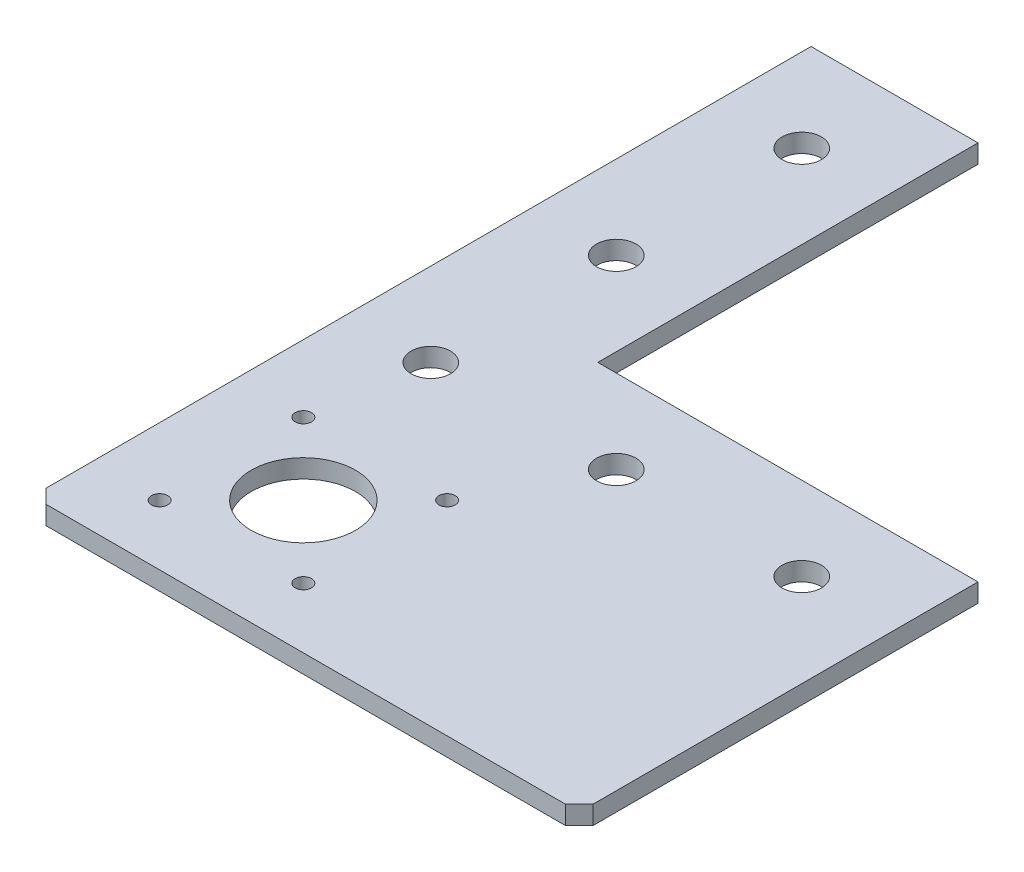
ISO-10303-21;
HEADER;
FILE_DESCRIPTION(('STEP AP214'),'2;1');
FILE_NAME('part.step','',(''),(''),'','','');
FILE_SCHEMA(('AUTOMOTIVE_DESIGN { 1 0 10303 214 1 1 1 1 }'));
ENDSEC;
DATA;
#1=APPLICATION_CONTEXT('core data for automotive mechanical design processes');
#2=APPLICATION_PROTOCOL_DEFINITION('international standard','automotive_design',2000,#1);
#3=PRODUCT_CONTEXT('',#1,'mechanical');
#4=PRODUCT('Part','Part','',(#3));
#5=PRODUCT_RELATED_PRODUCT_CATEGORY('part','',(#4));
#6=PRODUCT_DEFINITION_FORMATION('','',#4);
#7=PRODUCT_DEFINITION_CONTEXT('part definition',#1,'design');
#8=PRODUCT_DEFINITION('design','',#6,#7);
#9=PRODUCT_DEFINITION_SHAPE('','',#8);
#10=(LENGTH_UNIT() NAMED_UNIT(*) SI_UNIT(.MILLI.,.METRE.));
#11=(NAMED_UNIT(*) PLANE_ANGLE_UNIT() SI_UNIT($,.RADIAN.));
#12=(NAMED_UNIT(*) SI_UNIT($,.STERADIAN.) SOLID_ANGLE_UNIT());
#13=UNCERTAINTY_MEASURE_WITH_UNIT(LENGTH_MEASURE(1.E-05),#10,'distance_accuracy_value','');
#14=(GEOMETRIC_REPRESENTATION_CONTEXT(3) GLOBAL_UNCERTAINTY_ASSIGNED_CONTEXT((#13)) GLOBAL_UNIT_ASSIGNED_CONTEXT((#10,
#11,#12)) REPRESENTATION_CONTEXT('',''));
#15=CARTESIAN_POINT('',(0.,0.,0.));
#16=DIRECTION('',(0.,0.,1.));
#17=DIRECTION('',(1.,0.,0.));
#18=AXIS2_PLACEMENT_3D('',#15,#16,#17);
#19=CARTESIAN_POINT('',(0.,4.,-5.99999999999999));
#20=DIRECTION('',(0.,0.,1.));
#21=DIRECTION('',(1.,0.,0.));
#22=AXIS2_PLACEMENT_3D('',#19,#20,#21);
#23=PLANE('',#22);
#24=DIRECTION('',(-1.,0.,0.));
#25=VECTOR('',#24,1.);
#26=CARTESIAN_POINT('',(0.,0.,-5.99999999999999));
#27=LINE('',#26,#25);
#28=CARTESIAN_POINT('',(88.,0.,-6.));
#29=VERTEX_POINT('',#28);
#30=CARTESIAN_POINT('',(6.00000000000001,0.,-5.99999999999999));
#31=VERTEX_POINT('',#30);
#32=EDGE_CURVE('E130',#29,#31,#27,.T.);
#33=ORIENTED_EDGE('',*,*,#32,.T.);
#34=DIRECTION('',(0.,-1.,0.));
#35=VECTOR('',#34,1.);
#36=CARTESIAN_POINT('',(6.00000000000001,4.,-5.99999999999999));
#37=LINE('',#36,#35);
#38=CARTESIAN_POINT('',(6.00000000000001,4.,-5.99999999999999));
#39=VERTEX_POINT('',#38);
#40=EDGE_CURVE('E110',#39,#31,#37,.T.);
#41=ORIENTED_EDGE('',*,*,#40,.F.);
#42=DIRECTION('',(-1.,0.,0.));
#43=VECTOR('',#42,1.);
#44=CARTESIAN_POINT('',(0.,4.,-5.99999999999999));
#45=LINE('',#44,#43);
#46=CARTESIAN_POINT('',(88.,4.,-6.));
#47=VERTEX_POINT('',#46);
#48=EDGE_CURVE('E117',#47,#39,#45,.T.);
#49=ORIENTED_EDGE('',*,*,#48,.F.);
#50=DIRECTION('',(0.,-1.,0.));
#51=VECTOR('',#50,1.);
#52=CARTESIAN_POINT('',(88.,4.,-6.));
#53=LINE('',#52,#51);
#54=EDGE_CURVE('E155',#47,#29,#53,.T.);
#55=ORIENTED_EDGE('',*,*,#54,.T.);
#56=EDGE_LOOP('',(#33,#41,#49,#55));
#57=FACE_BOUND('',#56,.T.);
#58=ADVANCED_FACE('F39',(#57),#23,.F.);
#59=CARTESIAN_POINT('',(6.00000000000001,4.,0.));
#60=DIRECTION('',(-1.,0.,0.));
#61=DIRECTION('',(0.,0.,1.));
#62=AXIS2_PLACEMENT_3D('',#59,#60,#61);
#63=PLANE('',#62);
#64=DIRECTION('',(0.,0.,-1.));
#65=VECTOR('',#64,1.);
#66=CARTESIAN_POINT('',(6.00000000000001,0.,0.));
#67=LINE('',#66,#65);
#68=CARTESIAN_POINT('',(6.00000000000001,0.,-88.));
#69=VERTEX_POINT('',#68);
#70=EDGE_CURVE('E210',#31,#69,#67,.T.);
#71=ORIENTED_EDGE('',*,*,#70,.T.);
#72=DIRECTION('',(0.,-1.,0.));
#73=VECTOR('',#72,1.);
#74=CARTESIAN_POINT('',(6.00000000000001,4.,-88.));
#75=LINE('',#74,#73);
#76=CARTESIAN_POINT('',(6.00000000000001,4.,-88.));
#77=VERTEX_POINT('',#76);
#78=EDGE_CURVE('E112',#77,#69,#75,.T.);
#79=ORIENTED_EDGE('',*,*,#78,.F.);
#80=DIRECTION('',(0.,0.,-1.));
#81=VECTOR('',#80,1.);
#82=CARTESIAN_POINT('',(6.00000000000001,4.,0.));
#83=LINE('',#82,#81);
#84=EDGE_CURVE('E105',#39,#77,#83,.T.);
#85=ORIENTED_EDGE('',*,*,#84,.F.);
#86=ORIENTED_EDGE('',*,*,#40,.T.);
#87=EDGE_LOOP('',(#71,#79,#85,#86));
#88=FACE_BOUND('',#87,.T.);
#89=ADVANCED_FACE('F108',(#88),#63,.F.);
#90=CARTESIAN_POINT('',(0.,4.,-88.));
#91=DIRECTION('',(0.,0.,-1.));
#92=DIRECTION('',(-1.,0.,0.));
#93=AXIS2_PLACEMENT_3D('',#90,#91,#92);
#94=PLANE('',#93);
#95=DIRECTION('',(1.,0.,0.));
#96=VECTOR('',#95,1.);
#97=CARTESIAN_POINT('',(0.,0.,-88.));
#98=LINE('',#97,#96);
#99=CARTESIAN_POINT('',(-30.,0.,-88.));
#100=VERTEX_POINT('',#99);
#101=EDGE_CURVE('E212',#100,#69,#98,.T.);
#102=ORIENTED_EDGE('',*,*,#101,.F.);
#103=DIRECTION('',(0.,-1.,0.));
#104=VECTOR('',#103,1.);
#105=CARTESIAN_POINT('',(-30.,4.,-88.));
#106=LINE('',#105,#104);
#107=CARTESIAN_POINT('',(-30.,4.,-88.));
#108=VERTEX_POINT('',#107);
#109=EDGE_CURVE('E136',#108,#100,#106,.T.);
#110=ORIENTED_EDGE('',*,*,#109,.F.);
#111=DIRECTION('',(1.,0.,0.));
#112=VECTOR('',#111,1.);
#113=CARTESIAN_POINT('',(0.,4.,-88.));
#114=LINE('',#113,#112);
#115=EDGE_CURVE('E116',#108,#77,#114,.T.);
#116=ORIENTED_EDGE('',*,*,#115,.T.);
#117=ORIENTED_EDGE('',*,*,#78,.T.);
#118=EDGE_LOOP('',(#102,#110,#116,#117));
#119=FACE_BOUND('',#118,.T.);
#120=ADVANCED_FACE('F223',(#119),#94,.T.);
#121=CARTESIAN_POINT('',(-30.,4.,0.));
#122=DIRECTION('',(-1.,0.,0.));
#123=DIRECTION('',(0.,0.,1.));
#124=AXIS2_PLACEMENT_3D('',#121,#122,#123);
#125=PLANE('',#124);
#126=DIRECTION('',(0.,0.,-1.));
#127=VECTOR('',#126,1.);
#128=CARTESIAN_POINT('',(-30.,0.,0.));
#129=LINE('',#128,#127);
#130=CARTESIAN_POINT('',(-30.,0.,77.));
#131=VERTEX_POINT('',#130);
#132=EDGE_CURVE('E215',#131,#100,#129,.T.);
#133=ORIENTED_EDGE('',*,*,#132,.F.);
#134=DIRECTION('',(0.,1.,0.));
#135=VECTOR('',#134,1.);
#136=CARTESIAN_POINT('',(-30.,4.,77.));
#137=LINE('',#136,#135);
#138=CARTESIAN_POINT('',(-30.,4.,77.));
#139=VERTEX_POINT('',#138);
#140=EDGE_CURVE('E11',#131,#139,#137,.T.);
#141=ORIENTED_EDGE('',*,*,#140,.T.);
#142=DIRECTION('',(0.,0.,-1.));
#143=VECTOR('',#142,1.);
#144=CARTESIAN_POINT('',(-30.,4.,0.));
#145=LINE('',#144,#143);
#146=EDGE_CURVE('E156',#139,#108,#145,.T.);
#147=ORIENTED_EDGE('',*,*,#146,.T.);
#148=ORIENTED_EDGE('',*,*,#109,.T.);
#149=EDGE_LOOP('',(#133,#141,#147,#148));
#150=FACE_BOUND('',#149,.T.);
#151=ADVANCED_FACE('F221',(#150),#125,.T.);
#152=CARTESIAN_POINT('',(-12.,4.,12.0111306113721));
#153=DIRECTION('',(0.,-1.,0.));
#154=DIRECTION('',(0.,0.,-1.));
#155=AXIS2_PLACEMENT_3D('',#152,#153,#154);
#156=CYLINDRICAL_SURFACE('',#155,4.25);
#157=CARTESIAN_POINT('',(-12.,4.,12.0111306113721));
#158=DIRECTION('',(0.,1.,0.));
#159=DIRECTION('',(0.,0.,1.));
#160=AXIS2_PLACEMENT_3D('',#157,#158,#159);
#161=CIRCLE('',#160,4.25);
#162=CARTESIAN_POINT('',(-12.,4.,16.2611306113721));
#163=VERTEX_POINT('',#162);
#164=EDGE_CURVE('E127',#163,#163,#161,.T.);
#165=ORIENTED_EDGE('',*,*,#164,.T.);
#166=EDGE_LOOP('',(#165));
#167=FACE_BOUND('',#166,.T.);
#168=CARTESIAN_POINT('',(-12.,0.,12.0111306113721));
#169=DIRECTION('',(0.,1.,0.));
#170=DIRECTION('',(0.,0.,1.));
#171=AXIS2_PLACEMENT_3D('',#168,#169,#170);
#172=CIRCLE('',#171,4.25);
#173=CARTESIAN_POINT('',(-12.,0.,16.2611306113721));
#174=VERTEX_POINT('',#173);
#175=EDGE_CURVE('E206',#174,#174,#172,.T.);
#176=ORIENTED_EDGE('',*,*,#175,.F.);
#177=EDGE_LOOP('',(#176));
#178=FACE_BOUND('',#177,.T.);
#179=ADVANCED_FACE('F270',(#167,#178),#156,.F.);
#180=CARTESIAN_POINT('',(28.,4.,12.0111306113721));
#181=DIRECTION('',(0.,-1.,0.));
#182=DIRECTION('',(0.,0.,-1.));
#183=AXIS2_PLACEMENT_3D('',#180,#181,#182);
#184=CYLINDRICAL_SURFACE('',#183,4.25);
#185=CARTESIAN_POINT('',(28.,4.,12.0111306113721));
#186=DIRECTION('',(0.,1.,0.));
#187=DIRECTION('',(0.,0.,1.));
#188=AXIS2_PLACEMENT_3D('',#185,#186,#187);
#189=CIRCLE('',#188,4.25);
#190=CARTESIAN_POINT('',(28.,4.,16.2611306113721));
#191=VERTEX_POINT('',#190);
#192=EDGE_CURVE('E187',#191,#191,#189,.T.);
#193=ORIENTED_EDGE('',*,*,#192,.T.);
#194=EDGE_LOOP('',(#193));
#195=FACE_BOUND('',#194,.T.);
#196=CARTESIAN_POINT('',(28.,0.,12.0111306113721));
#197=DIRECTION('',(0.,1.,0.));
#198=DIRECTION('',(0.,0.,1.));
#199=AXIS2_PLACEMENT_3D('',#196,#197,#198);
#200=CIRCLE('',#199,4.25);
#201=CARTESIAN_POINT('',(28.,0.,16.2611306113721));
#202=VERTEX_POINT('',#201);
#203=EDGE_CURVE('E203',#202,#202,#200,.T.);
#204=ORIENTED_EDGE('',*,*,#203,.F.);
#205=EDGE_LOOP('',(#204));
#206=FACE_BOUND('',#205,.T.);
#207=ADVANCED_FACE('F273',(#195,#206),#184,.F.);
#208=CARTESIAN_POINT('',(68.,4.,12.0111306113721));
#209=DIRECTION('',(0.,-1.,0.));
#210=DIRECTION('',(0.,0.,-1.));
#211=AXIS2_PLACEMENT_3D('',#208,#209,#210);
#212=CYLINDRICAL_SURFACE('',#211,4.24999999999999);
#213=CARTESIAN_POINT('',(68.,4.,12.0111306113721));
#214=DIRECTION('',(0.,1.,0.));
#215=DIRECTION('',(0.,0.,1.));
#216=AXIS2_PLACEMENT_3D('',#213,#214,#215);
#217=CIRCLE('',#216,4.24999999999999);
#218=CARTESIAN_POINT('',(68.,4.,16.2611306113721));
#219=VERTEX_POINT('',#218);
#220=EDGE_CURVE('E184',#219,#219,#217,.T.);
#221=ORIENTED_EDGE('',*,*,#220,.T.);
#222=EDGE_LOOP('',(#221));
#223=FACE_BOUND('',#222,.T.);
#224=CARTESIAN_POINT('',(68.,0.,12.0111306113721));
#225=DIRECTION('',(0.,1.,0.));
#226=DIRECTION('',(0.,0.,1.));
#227=AXIS2_PLACEMENT_3D('',#224,#225,#226);
#228=CIRCLE('',#227,4.24999999999999);
#229=CARTESIAN_POINT('',(68.,0.,16.2611306113721));
#230=VERTEX_POINT('',#229);
#231=EDGE_CURVE('E200',#230,#230,#228,.T.);
#232=ORIENTED_EDGE('',*,*,#231,.F.);
#233=EDGE_LOOP('',(#232));
#234=FACE_BOUND('',#233,.T.);
#235=ADVANCED_FACE('F277',(#223,#234),#212,.F.);
#236=CARTESIAN_POINT('',(-12.0000000000001,4.,-27.9888693886279));
#237=DIRECTION('',(0.,-1.,0.));
#238=DIRECTION('',(0.,0.,-1.));
#239=AXIS2_PLACEMENT_3D('',#236,#237,#238);
#240=CYLINDRICAL_SURFACE('',#239,4.25);
#241=CARTESIAN_POINT('',(-12.0000000000001,4.,-27.9888693886279));
#242=DIRECTION('',(0.,1.,0.));
#243=DIRECTION('',(0.,0.,1.));
#244=AXIS2_PLACEMENT_3D('',#241,#242,#243);
#245=CIRCLE('',#244,4.25);
#246=CARTESIAN_POINT('',(-12.0000000000001,4.,-23.7388693886279));
#247=VERTEX_POINT('',#246);
#248=EDGE_CURVE('E181',#247,#247,#245,.T.);
#249=ORIENTED_EDGE('',*,*,#248,.T.);
#250=EDGE_LOOP('',(#249));
#251=FACE_BOUND('',#250,.T.);
#252=CARTESIAN_POINT('',(-12.0000000000001,0.,-27.9888693886279));
#253=DIRECTION('',(0.,1.,0.));
#254=DIRECTION('',(0.,0.,1.));
#255=AXIS2_PLACEMENT_3D('',#252,#253,#254);
#256=CIRCLE('',#255,4.25);
#257=CARTESIAN_POINT('',(-12.0000000000001,0.,-23.7388693886279));
#258=VERTEX_POINT('',#257);
#259=EDGE_CURVE('E197',#258,#258,#256,.T.);
#260=ORIENTED_EDGE('',*,*,#259,.F.);
#261=EDGE_LOOP('',(#260));
#262=FACE_BOUND('',#261,.T.);
#263=ADVANCED_FACE('F281',(#251,#262),#240,.F.);
#264=CARTESIAN_POINT('',(-12.0000000000003,4.,-67.9888693886279));
#265=DIRECTION('',(0.,-1.,0.));
#266=DIRECTION('',(0.,0.,-1.));
#267=AXIS2_PLACEMENT_3D('',#264,#265,#266);
#268=CYLINDRICAL_SURFACE('',#267,4.25);
#269=CARTESIAN_POINT('',(-12.0000000000003,4.,-67.9888693886279));
#270=DIRECTION('',(0.,1.,0.));
#271=DIRECTION('',(0.,0.,1.));
#272=AXIS2_PLACEMENT_3D('',#269,#270,#271);
#273=CIRCLE('',#272,4.25);
#274=CARTESIAN_POINT('',(-12.0000000000003,4.,-63.7388693886279));
#275=VERTEX_POINT('',#274);
#276=EDGE_CURVE('E178',#275,#275,#273,.T.);
#277=ORIENTED_EDGE('',*,*,#276,.T.);
#278=EDGE_LOOP('',(#277));
#279=FACE_BOUND('',#278,.T.);
#280=CARTESIAN_POINT('',(-12.0000000000003,0.,-67.9888693886279));
#281=DIRECTION('',(0.,1.,0.));
#282=DIRECTION('',(0.,0.,1.));
#283=AXIS2_PLACEMENT_3D('',#280,#281,#282);
#284=CIRCLE('',#283,4.25);
#285=CARTESIAN_POINT('',(-12.0000000000003,0.,-63.7388693886279));
#286=VERTEX_POINT('',#285);
#287=EDGE_CURVE('E194',#286,#286,#284,.T.);
#288=ORIENTED_EDGE('',*,*,#287,.F.);
#289=EDGE_LOOP('',(#288));
#290=FACE_BOUND('',#289,.T.);
#291=ADVANCED_FACE('F285',(#279,#290),#268,.F.);
#292=CARTESIAN_POINT('',(88.,4.,0.));
#293=DIRECTION('',(-1.,0.,0.));
#294=DIRECTION('',(0.,0.,1.));
#295=AXIS2_PLACEMENT_3D('',#292,#293,#294);
#296=PLANE('',#295);
#297=DIRECTION('',(0.,0.,-1.));
#298=VECTOR('',#297,1.);
#299=CARTESIAN_POINT('',(88.,4.,0.));
#300=LINE('',#299,#298);
#301=CARTESIAN_POINT('',(88.,4.,77.));
#302=VERTEX_POINT('',#301);
#303=EDGE_CURVE('E123',#302,#47,#300,.T.);
#304=ORIENTED_EDGE('',*,*,#303,.F.);
#305=DIRECTION('',(0.,-1.,0.));
#306=VECTOR('',#305,1.);
#307=CARTESIAN_POINT('',(88.,4.,77.));
#308=LINE('',#307,#306);
#309=CARTESIAN_POINT('',(88.,0.,77.));
#310=VERTEX_POINT('',#309);
#311=EDGE_CURVE('E131',#302,#310,#308,.T.);
#312=ORIENTED_EDGE('',*,*,#311,.T.);
#313=DIRECTION('',(0.,0.,-1.));
#314=VECTOR('',#313,1.);
#315=CARTESIAN_POINT('',(88.,0.,0.));
#316=LINE('',#315,#314);
#317=EDGE_CURVE('E164',#310,#29,#316,.T.);
#318=ORIENTED_EDGE('',*,*,#317,.T.);
#319=ORIENTED_EDGE('',*,*,#54,.F.);
#320=EDGE_LOOP('',(#304,#312,#318,#319));
#321=FACE_BOUND('',#320,.T.);
#322=ADVANCED_FACE('F153',(#321),#296,.F.);
#323=CARTESIAN_POINT('',(0.,4.,0.));
#324=DIRECTION('',(0.,1.,0.));
#325=DIRECTION('',(0.,0.,1.));
#326=AXIS2_PLACEMENT_3D('',#323,#324,#325);
#327=PLANE('',#326);
#328=ORIENTED_EDGE('',*,*,#276,.F.);
#329=EDGE_LOOP('',(#328));
#330=FACE_BOUND('',#329,.T.);
#331=ORIENTED_EDGE('',*,*,#248,.F.);
#332=EDGE_LOOP('',(#331));
#333=FACE_BOUND('',#332,.T.);
#334=ORIENTED_EDGE('',*,*,#220,.F.);
#335=EDGE_LOOP('',(#334));
#336=FACE_BOUND('',#335,.T.);
#337=ORIENTED_EDGE('',*,*,#192,.F.);
#338=EDGE_LOOP('',(#337));
#339=FACE_BOUND('',#338,.T.);
#340=ORIENTED_EDGE('',*,*,#164,.F.);
#341=EDGE_LOOP('',(#340));
#342=FACE_BOUND('',#341,.T.);
#343=DIRECTION('',(1.,0.,0.));
#344=VECTOR('',#343,1.);
#345=CARTESIAN_POINT('',(0.,4.,80.));
#346=LINE('',#345,#344);
#347=CARTESIAN_POINT('',(-27.,4.,80.));
#348=VERTEX_POINT('',#347);
#349=CARTESIAN_POINT('',(85.,4.,80.));
#350=VERTEX_POINT('',#349);
#351=EDGE_CURVE('E149',#348,#350,#346,.T.);
#352=ORIENTED_EDGE('',*,*,#351,.T.);
#353=DIRECTION('',(-0.707106781186548,0.,0.707106781186548));
#354=VECTOR('',#353,1.);
#355=CARTESIAN_POINT('',(82.5,4.,82.5));
#356=LINE('',#355,#354);
#357=EDGE_CURVE('E47',#350,#302,#356,.F.);
#358=ORIENTED_EDGE('',*,*,#357,.T.);
#359=ORIENTED_EDGE('',*,*,#303,.T.);
#360=ORIENTED_EDGE('',*,*,#48,.T.);
#361=ORIENTED_EDGE('',*,*,#84,.T.);
#362=ORIENTED_EDGE('',*,*,#115,.F.);
#363=ORIENTED_EDGE('',*,*,#146,.F.);
#364=DIRECTION('',(0.707106781186544,0.,0.707106781186551));
#365=VECTOR('',#364,1.);
#366=CARTESIAN_POINT('',(-53.5000000000001,4.,53.4999999999996));
#367=LINE('',#366,#365);
#368=EDGE_CURVE('E147',#139,#348,#367,.T.);
#369=ORIENTED_EDGE('',*,*,#368,.T.);
#370=EDGE_LOOP('',(#352,#358,#359,#360,#361,#362,#363,#369));
#371=FACE_BOUND('',#370,.T.);
#372=CARTESIAN_POINT('',(0.,4.,51.5));
#373=DIRECTION('',(0.,1.,0.));
#374=DIRECTION('',(0.,0.,1.));
#375=AXIS2_PLACEMENT_3D('',#372,#373,#374);
#376=CIRCLE('',#375,11.25);
#377=CARTESIAN_POINT('',(0.,4.,62.75));
#378=VERTEX_POINT('',#377);
#379=EDGE_CURVE('E167',#378,#378,#376,.T.);
#380=ORIENTED_EDGE('',*,*,#379,.F.);
#381=EDGE_LOOP('',(#380));
#382=FACE_BOUND('',#381,.T.);
#383=CARTESIAN_POINT('',(15.5000000000003,4.,67.));
#384=DIRECTION('',(0.,1.,0.));
#385=DIRECTION('',(0.,0.,1.));
#386=AXIS2_PLACEMENT_3D('',#383,#384,#385);
#387=CIRCLE('',#386,1.75);
#388=CARTESIAN_POINT('',(15.5000000000003,4.,68.75));
#389=VERTEX_POINT('',#388);
#390=EDGE_CURVE('E171',#389,#389,#387,.T.);
#391=ORIENTED_EDGE('',*,*,#390,.F.);
#392=EDGE_LOOP('',(#391));
#393=FACE_BOUND('',#392,.T.);
#394=CARTESIAN_POINT('',(-15.4999999999997,4.,67.));
#395=DIRECTION('',(0.,1.,0.));
#396=DIRECTION('',(0.,0.,1.));
#397=AXIS2_PLACEMENT_3D('',#394,#395,#396);
#398=CIRCLE('',#397,1.75);
#399=CARTESIAN_POINT('',(-15.4999999999997,4.,68.75));
#400=VERTEX_POINT('',#399);
#401=EDGE_CURVE('E481',#400,#400,#398,.T.);
#402=ORIENTED_EDGE('',*,*,#401,.F.);
#403=EDGE_LOOP('',(#402));
#404=FACE_BOUND('',#403,.T.);
#405=CARTESIAN_POINT('',(15.5,4.,36.));
#406=DIRECTION('',(0.,1.,0.));
#407=DIRECTION('',(0.,0.,1.));
#408=AXIS2_PLACEMENT_3D('',#405,#406,#407);
#409=CIRCLE('',#408,1.75);
#410=CARTESIAN_POINT('',(15.5,4.,37.75));
#411=VERTEX_POINT('',#410);
#412=EDGE_CURVE('E229',#411,#411,#409,.T.);
#413=ORIENTED_EDGE('',*,*,#412,.F.);
#414=EDGE_LOOP('',(#413));
#415=FACE_BOUND('',#414,.T.);
#416=CARTESIAN_POINT('',(-15.5,4.,36.));
#417=DIRECTION('',(0.,1.,0.));
#418=DIRECTION('',(0.,0.,1.));
#419=AXIS2_PLACEMENT_3D('',#416,#417,#418);
#420=CIRCLE('',#419,1.75);
#421=CARTESIAN_POINT('',(-15.5,4.,37.75));
#422=VERTEX_POINT('',#421);
#423=EDGE_CURVE('E226',#422,#422,#420,.T.);
#424=ORIENTED_EDGE('',*,*,#423,.F.);
#425=EDGE_LOOP('',(#424));
#426=FACE_BOUND('',#425,.T.);
#427=ADVANCED_FACE('F120',(#330,#333,#336,#339,#342,#371,#382,#393,#404,#415,#426),#327,.T.);
#428=CARTESIAN_POINT('',(0.,0.,0.));
#429=DIRECTION('',(0.,1.,0.));
#430=DIRECTION('',(0.,0.,1.));
#431=AXIS2_PLACEMENT_3D('',#428,#429,#430);
#432=PLANE('',#431);
#433=ORIENTED_EDGE('',*,*,#287,.T.);
#434=EDGE_LOOP('',(#433));
#435=FACE_BOUND('',#434,.T.);
#436=ORIENTED_EDGE('',*,*,#259,.T.);
#437=EDGE_LOOP('',(#436));
#438=FACE_BOUND('',#437,.T.);
#439=ORIENTED_EDGE('',*,*,#231,.T.);
#440=EDGE_LOOP('',(#439));
#441=FACE_BOUND('',#440,.T.);
#442=ORIENTED_EDGE('',*,*,#203,.T.);
#443=EDGE_LOOP('',(#442));
#444=FACE_BOUND('',#443,.T.);
#445=ORIENTED_EDGE('',*,*,#175,.T.);
#446=EDGE_LOOP('',(#445));
#447=FACE_BOUND('',#446,.T.);
#448=ORIENTED_EDGE('',*,*,#317,.F.);
#449=DIRECTION('',(0.707106781186548,0.,-0.707106781186548));
#450=VECTOR('',#449,1.);
#451=CARTESIAN_POINT('',(88.,0.,77.));
#452=LINE('',#451,#450);
#453=CARTESIAN_POINT('',(85.,0.,80.));
#454=VERTEX_POINT('',#453);
#455=EDGE_CURVE('E141',#310,#454,#452,.F.);
#456=ORIENTED_EDGE('',*,*,#455,.T.);
#457=DIRECTION('',(1.,0.,0.));
#458=VECTOR('',#457,1.);
#459=CARTESIAN_POINT('',(0.,0.,80.));
#460=LINE('',#459,#458);
#461=CARTESIAN_POINT('',(-27.,0.,80.));
#462=VERTEX_POINT('',#461);
#463=EDGE_CURVE('E163',#462,#454,#460,.T.);
#464=ORIENTED_EDGE('',*,*,#463,.F.);
#465=DIRECTION('',(-0.707106781186544,0.,-0.707106781186551));
#466=VECTOR('',#465,1.);
#467=CARTESIAN_POINT('',(-27.,0.,80.));
#468=LINE('',#467,#466);
#469=EDGE_CURVE('E134',#462,#131,#468,.T.);
#470=ORIENTED_EDGE('',*,*,#469,.T.);
#471=ORIENTED_EDGE('',*,*,#132,.T.);
#472=ORIENTED_EDGE('',*,*,#101,.T.);
#473=ORIENTED_EDGE('',*,*,#70,.F.);
#474=ORIENTED_EDGE('',*,*,#32,.F.);
#475=EDGE_LOOP('',(#448,#456,#464,#470,#471,#472,#473,#474));
#476=FACE_BOUND('',#475,.T.);
#477=CARTESIAN_POINT('',(0.,0.,51.5));
#478=DIRECTION('',(0.,1.,0.));
#479=DIRECTION('',(0.,0.,1.));
#480=AXIS2_PLACEMENT_3D('',#477,#478,#479);
#481=CIRCLE('',#480,11.25);
#482=CARTESIAN_POINT('',(0.,0.,62.75));
#483=VERTEX_POINT('',#482);
#484=EDGE_CURVE('E233',#483,#483,#481,.T.);
#485=ORIENTED_EDGE('',*,*,#484,.T.);
#486=EDGE_LOOP('',(#485));
#487=FACE_BOUND('',#486,.T.);
#488=CARTESIAN_POINT('',(15.5000000000003,0.,67.));
#489=DIRECTION('',(0.,1.,0.));
#490=DIRECTION('',(0.,0.,1.));
#491=AXIS2_PLACEMENT_3D('',#488,#489,#490);
#492=CIRCLE('',#491,1.75);
#493=CARTESIAN_POINT('',(15.5000000000003,0.,68.75));
#494=VERTEX_POINT('',#493);
#495=EDGE_CURVE('E236',#494,#494,#492,.T.);
#496=ORIENTED_EDGE('',*,*,#495,.T.);
#497=EDGE_LOOP('',(#496));
#498=FACE_BOUND('',#497,.T.);
#499=CARTESIAN_POINT('',(-15.4999999999997,0.,67.));
#500=DIRECTION('',(0.,1.,0.));
#501=DIRECTION('',(0.,0.,1.));
#502=AXIS2_PLACEMENT_3D('',#499,#500,#501);
#503=CIRCLE('',#502,1.75);
#504=CARTESIAN_POINT('',(-15.4999999999997,0.,68.75));
#505=VERTEX_POINT('',#504);
#506=EDGE_CURVE('E239',#505,#505,#503,.T.);
#507=ORIENTED_EDGE('',*,*,#506,.T.);
#508=EDGE_LOOP('',(#507));
#509=FACE_BOUND('',#508,.T.);
#510=CARTESIAN_POINT('',(15.5,0.,36.));
#511=DIRECTION('',(0.,1.,0.));
#512=DIRECTION('',(0.,0.,1.));
#513=AXIS2_PLACEMENT_3D('',#510,#511,#512);
#514=CIRCLE('',#513,1.75);
#515=CARTESIAN_POINT('',(15.5,0.,37.75));
#516=VERTEX_POINT('',#515);
#517=EDGE_CURVE('E174',#516,#516,#514,.T.);
#518=ORIENTED_EDGE('',*,*,#517,.T.);
#519=EDGE_LOOP('',(#518));
#520=FACE_BOUND('',#519,.T.);
#521=CARTESIAN_POINT('',(-15.5,0.,36.));
#522=DIRECTION('',(0.,1.,0.));
#523=DIRECTION('',(0.,0.,1.));
#524=AXIS2_PLACEMENT_3D('',#521,#522,#523);
#525=CIRCLE('',#524,1.75);
#526=CARTESIAN_POINT('',(-15.5,0.,37.75));
#527=VERTEX_POINT('',#526);
#528=EDGE_CURVE('E168',#527,#527,#525,.T.);
#529=ORIENTED_EDGE('',*,*,#528,.T.);
#530=EDGE_LOOP('',(#529));
#531=FACE_BOUND('',#530,.T.);
#532=ADVANCED_FACE('F161',(#435,#438,#441,#444,#447,#476,#487,#498,#509,#520,#531),#432,.F.);
#533=CARTESIAN_POINT('',(0.,4.,80.));
#534=DIRECTION('',(0.,0.,-1.));
#535=DIRECTION('',(-1.,0.,0.));
#536=AXIS2_PLACEMENT_3D('',#533,#534,#535);
#537=PLANE('',#536);
#538=ORIENTED_EDGE('',*,*,#463,.T.);
#539=DIRECTION('',(0.,1.,0.));
#540=VECTOR('',#539,1.);
#541=CARTESIAN_POINT('',(85.,4.,80.));
#542=LINE('',#541,#540);
#543=EDGE_CURVE('E60',#454,#350,#542,.T.);
#544=ORIENTED_EDGE('',*,*,#543,.T.);
#545=ORIENTED_EDGE('',*,*,#351,.F.);
#546=DIRECTION('',(0.,-1.,0.));
#547=VECTOR('',#546,1.);
#548=CARTESIAN_POINT('',(-27.,0.,80.));
#549=LINE('',#548,#547);
#550=EDGE_CURVE('E143',#348,#462,#549,.T.);
#551=ORIENTED_EDGE('',*,*,#550,.T.);
#552=EDGE_LOOP('',(#538,#544,#545,#551));
#553=FACE_BOUND('',#552,.T.);
#554=ADVANCED_FACE('F165',(#553),#537,.F.);
#555=CARTESIAN_POINT('',(-15.5,4.,36.));
#556=DIRECTION('',(0.,-1.,0.));
#557=DIRECTION('',(0.,0.,-1.));
#558=AXIS2_PLACEMENT_3D('',#555,#556,#557);
#559=CYLINDRICAL_SURFACE('',#558,1.75);
#560=ORIENTED_EDGE('',*,*,#423,.T.);
#561=EDGE_LOOP('',(#560));
#562=FACE_BOUND('',#561,.T.);
#563=ORIENTED_EDGE('',*,*,#528,.F.);
#564=EDGE_LOOP('',(#563));
#565=FACE_BOUND('',#564,.T.);
#566=ADVANCED_FACE('F249',(#562,#565),#559,.F.);
#567=CARTESIAN_POINT('',(15.5,4.,36.));
#568=DIRECTION('',(0.,-1.,0.));
#569=DIRECTION('',(0.,0.,-1.));
#570=AXIS2_PLACEMENT_3D('',#567,#568,#569);
#571=CYLINDRICAL_SURFACE('',#570,1.75);
#572=ORIENTED_EDGE('',*,*,#412,.T.);
#573=EDGE_LOOP('',(#572));
#574=FACE_BOUND('',#573,.T.);
#575=ORIENTED_EDGE('',*,*,#517,.F.);
#576=EDGE_LOOP('',(#575));
#577=FACE_BOUND('',#576,.T.);
#578=ADVANCED_FACE('F246',(#574,#577),#571,.F.);
#579=CARTESIAN_POINT('',(-15.4999999999997,4.,67.));
#580=DIRECTION('',(0.,-1.,0.));
#581=DIRECTION('',(0.,0.,-1.));
#582=AXIS2_PLACEMENT_3D('',#579,#580,#581);
#583=CYLINDRICAL_SURFACE('',#582,1.75);
#584=ORIENTED_EDGE('',*,*,#401,.T.);
#585=EDGE_LOOP('',(#584));
#586=FACE_BOUND('',#585,.T.);
#587=ORIENTED_EDGE('',*,*,#506,.F.);
#588=EDGE_LOOP('',(#587));
#589=FACE_BOUND('',#588,.T.);
#590=ADVANCED_FACE('F248',(#586,#589),#583,.F.);
#591=CARTESIAN_POINT('',(15.5000000000003,4.,67.));
#592=DIRECTION('',(0.,-1.,0.));
#593=DIRECTION('',(0.,0.,-1.));
#594=AXIS2_PLACEMENT_3D('',#591,#592,#593);
#595=CYLINDRICAL_SURFACE('',#594,1.75);
#596=ORIENTED_EDGE('',*,*,#390,.T.);
#597=EDGE_LOOP('',(#596));
#598=FACE_BOUND('',#597,.T.);
#599=ORIENTED_EDGE('',*,*,#495,.F.);
#600=EDGE_LOOP('',(#599));
#601=FACE_BOUND('',#600,.T.);
#602=ADVANCED_FACE('F256',(#598,#601),#595,.F.);
#603=CARTESIAN_POINT('',(0.,4.,51.5));
#604=DIRECTION('',(0.,-1.,0.));
#605=DIRECTION('',(0.,0.,-1.));
#606=AXIS2_PLACEMENT_3D('',#603,#604,#605);
#607=CYLINDRICAL_SURFACE('',#606,11.25);
#608=ORIENTED_EDGE('',*,*,#379,.T.);
#609=EDGE_LOOP('',(#608));
#610=FACE_BOUND('',#609,.T.);
#611=ORIENTED_EDGE('',*,*,#484,.F.);
#612=EDGE_LOOP('',(#611));
#613=FACE_BOUND('',#612,.T.);
#614=ADVANCED_FACE('F290',(#610,#613),#607,.F.);
#615=CARTESIAN_POINT('',(88.,4.,77.));
#616=DIRECTION('',(-0.707106781186547,0.,-0.707106781186547));
#617=DIRECTION('',(0.,-1.,0.));
#618=AXIS2_PLACEMENT_3D('',#615,#616,#617);
#619=PLANE('',#618);
#620=ORIENTED_EDGE('',*,*,#357,.F.);
#621=ORIENTED_EDGE('',*,*,#543,.F.);
#622=ORIENTED_EDGE('',*,*,#455,.F.);
#623=ORIENTED_EDGE('',*,*,#311,.F.);
#624=EDGE_LOOP('',(#620,#621,#622,#623));
#625=FACE_BOUND('',#624,.T.);
#626=ADVANCED_FACE('F158',(#625),#619,.F.);
#627=CARTESIAN_POINT('',(-27.,4.,80.));
#628=DIRECTION('',(-0.707106781186551,0.,0.707106781186544));
#629=DIRECTION('',(0.,1.,0.));
#630=AXIS2_PLACEMENT_3D('',#627,#628,#629);
#631=PLANE('',#630);
#632=ORIENTED_EDGE('',*,*,#368,.F.);
#633=ORIENTED_EDGE('',*,*,#140,.F.);
#634=ORIENTED_EDGE('',*,*,#469,.F.);
#635=ORIENTED_EDGE('',*,*,#550,.F.);
#636=EDGE_LOOP('',(#632,#633,#634,#635));
#637=FACE_BOUND('',#636,.T.);
#638=ADVANCED_FACE('F41',(#637),#631,.T.);
#639=CLOSED_SHELL('',(#58,#89,#120,#151,#179,#207,#235,#263,#291,#322,#427,#532,#554,#566,#578,
#590,#602,#614,#626,#638));
#640=MANIFOLD_SOLID_BREP('B2',#639);
#641=ADVANCED_BREP_SHAPE_REPRESENTATION('',(#18,#640),#14);
#642=SHAPE_DEFINITION_REPRESENTATION(#9,#641);
ENDSEC;
END-ISO-10303-21;
